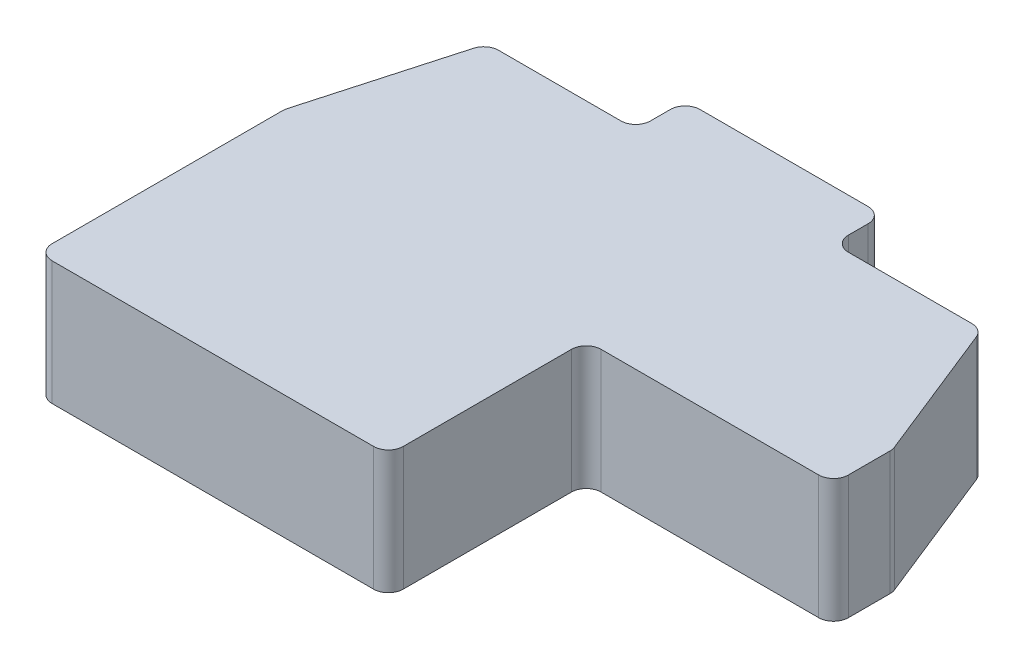
ISO-10303-21;
HEADER;
FILE_DESCRIPTION(('STEP AP214'),'2;1');
FILE_NAME('part.step','',(''),(''),'','','');
FILE_SCHEMA(('AUTOMOTIVE_DESIGN { 1 0 10303 214 1 1 1 1 }'));
ENDSEC;
DATA;
#1=APPLICATION_CONTEXT('core data for automotive mechanical design processes');
#2=APPLICATION_PROTOCOL_DEFINITION('international standard','automotive_design',2000,#1);
#3=PRODUCT_CONTEXT('',#1,'mechanical');
#4=PRODUCT('Part','Part','',(#3));
#5=PRODUCT_RELATED_PRODUCT_CATEGORY('part','',(#4));
#6=PRODUCT_DEFINITION_FORMATION('','',#4);
#7=PRODUCT_DEFINITION_CONTEXT('part definition',#1,'design');
#8=PRODUCT_DEFINITION('design','',#6,#7);
#9=PRODUCT_DEFINITION_SHAPE('','',#8);
#10=(LENGTH_UNIT() NAMED_UNIT(*) SI_UNIT(.MILLI.,.METRE.));
#11=(NAMED_UNIT(*) PLANE_ANGLE_UNIT() SI_UNIT($,.RADIAN.));
#12=(NAMED_UNIT(*) SI_UNIT($,.STERADIAN.) SOLID_ANGLE_UNIT());
#13=UNCERTAINTY_MEASURE_WITH_UNIT(LENGTH_MEASURE(1.E-05),#10,'distance_accuracy_value','');
#14=(GEOMETRIC_REPRESENTATION_CONTEXT(3) GLOBAL_UNCERTAINTY_ASSIGNED_CONTEXT((#13)) GLOBAL_UNIT_ASSIGNED_CONTEXT((#10,
#11,#12)) REPRESENTATION_CONTEXT('',''));
#15=CARTESIAN_POINT('',(0.,0.,0.));
#16=DIRECTION('',(0.,0.,1.));
#17=DIRECTION('',(1.,0.,0.));
#18=AXIS2_PLACEMENT_3D('',#15,#16,#17);
#19=CARTESIAN_POINT('',(5.00000000000001,25.,-49.));
#20=DIRECTION('',(0.,-1.,0.));
#21=DIRECTION('',(0.,0.,-1.));
#22=AXIS2_PLACEMENT_3D('',#19,#20,#21);
#23=CYLINDRICAL_SURFACE('',#22,3.);
#24=CARTESIAN_POINT('',(5.00000000000001,0.,-49.));
#25=DIRECTION('',(0.,1.,0.));
#26=DIRECTION('',(0.,0.,1.));
#27=AXIS2_PLACEMENT_3D('',#24,#25,#26);
#28=CIRCLE('',#27,3.);
#29=CARTESIAN_POINT('',(8.00000000000001,0.,-49.));
#30=VERTEX_POINT('',#29);
#31=CARTESIAN_POINT('',(4.99999999999999,0.,-52.));
#32=VERTEX_POINT('',#31);
#33=EDGE_CURVE('E233',#30,#32,#28,.T.);
#34=ORIENTED_EDGE('',*,*,#33,.T.);
#35=DIRECTION('',(0.,-1.,0.));
#36=VECTOR('',#35,1.);
#37=CARTESIAN_POINT('',(4.99999999999999,25.,-52.));
#38=LINE('',#37,#36);
#39=CARTESIAN_POINT('',(4.99999999999999,25.,-52.));
#40=VERTEX_POINT('',#39);
#41=EDGE_CURVE('E11',#40,#32,#38,.T.);
#42=ORIENTED_EDGE('',*,*,#41,.F.);
#43=CARTESIAN_POINT('',(5.00000000000001,25.,-49.));
#44=DIRECTION('',(0.,1.,0.));
#45=DIRECTION('',(0.,0.,1.));
#46=AXIS2_PLACEMENT_3D('',#43,#44,#45);
#47=CIRCLE('',#46,3.);
#48=CARTESIAN_POINT('',(8.00000000000001,25.,-49.));
#49=VERTEX_POINT('',#48);
#50=EDGE_CURVE('E279',#49,#40,#47,.T.);
#51=ORIENTED_EDGE('',*,*,#50,.F.);
#52=DIRECTION('',(0.,-1.,0.));
#53=VECTOR('',#52,1.);
#54=CARTESIAN_POINT('',(8.00000000000001,25.,-49.));
#55=LINE('',#54,#53);
#56=EDGE_CURVE('E229',#49,#30,#55,.T.);
#57=ORIENTED_EDGE('',*,*,#56,.T.);
#58=EDGE_LOOP('',(#34,#42,#51,#57));
#59=FACE_BOUND('',#58,.T.);
#60=ADVANCED_FACE('F41',(#59),#23,.T.);
#61=CARTESIAN_POINT('',(4.99999999999999,25.,-52.));
#62=DIRECTION('',(0.,0.,1.));
#63=DIRECTION('',(1.,0.,0.));
#64=AXIS2_PLACEMENT_3D('',#61,#62,#63);
#65=PLANE('',#64);
#66=DIRECTION('',(-1.,0.,0.));
#67=VECTOR('',#66,1.);
#68=CARTESIAN_POINT('',(4.99999999999999,0.,-52.));
#69=LINE('',#68,#67);
#70=CARTESIAN_POINT('',(-29.,0.,-52.));
#71=VERTEX_POINT('',#70);
#72=EDGE_CURVE('E236',#32,#71,#69,.T.);
#73=ORIENTED_EDGE('',*,*,#72,.T.);
#74=DIRECTION('',(0.,-1.,0.));
#75=VECTOR('',#74,1.);
#76=CARTESIAN_POINT('',(-29.,25.,-52.));
#77=LINE('',#76,#75);
#78=CARTESIAN_POINT('',(-29.,25.,-52.));
#79=VERTEX_POINT('',#78);
#80=EDGE_CURVE('E49',#79,#71,#77,.T.);
#81=ORIENTED_EDGE('',*,*,#80,.F.);
#82=DIRECTION('',(-1.,0.,0.));
#83=VECTOR('',#82,1.);
#84=CARTESIAN_POINT('',(4.99999999999999,25.,-52.));
#85=LINE('',#84,#83);
#86=EDGE_CURVE('E148',#40,#79,#85,.T.);
#87=ORIENTED_EDGE('',*,*,#86,.F.);
#88=ORIENTED_EDGE('',*,*,#41,.T.);
#89=EDGE_LOOP('',(#73,#81,#87,#88));
#90=FACE_BOUND('',#89,.T.);
#91=ADVANCED_FACE('F417',(#90),#65,.F.);
#92=CARTESIAN_POINT('',(-29.,25.,-49.));
#93=DIRECTION('',(0.,-1.,0.));
#94=DIRECTION('',(0.,0.,-1.));
#95=AXIS2_PLACEMENT_3D('',#92,#93,#94);
#96=CYLINDRICAL_SURFACE('',#95,3.);
#97=CARTESIAN_POINT('',(-29.,0.,-49.));
#98=DIRECTION('',(0.,1.,0.));
#99=DIRECTION('',(0.,0.,1.));
#100=AXIS2_PLACEMENT_3D('',#97,#98,#99);
#101=CIRCLE('',#100,3.);
#102=CARTESIAN_POINT('',(-32.,0.,-49.));
#103=VERTEX_POINT('',#102);
#104=EDGE_CURVE('E238',#71,#103,#101,.T.);
#105=ORIENTED_EDGE('',*,*,#104,.T.);
#106=DIRECTION('',(0.,-1.,0.));
#107=VECTOR('',#106,1.);
#108=CARTESIAN_POINT('',(-32.,25.,-49.));
#109=LINE('',#108,#107);
#110=CARTESIAN_POINT('',(-32.,25.,-49.));
#111=VERTEX_POINT('',#110);
#112=EDGE_CURVE('E334',#111,#103,#109,.T.);
#113=ORIENTED_EDGE('',*,*,#112,.F.);
#114=CARTESIAN_POINT('',(-29.,25.,-49.));
#115=DIRECTION('',(0.,1.,0.));
#116=DIRECTION('',(0.,0.,1.));
#117=AXIS2_PLACEMENT_3D('',#114,#115,#116);
#118=CIRCLE('',#117,3.);
#119=EDGE_CURVE('E342',#79,#111,#118,.T.);
#120=ORIENTED_EDGE('',*,*,#119,.F.);
#121=ORIENTED_EDGE('',*,*,#80,.T.);
#122=EDGE_LOOP('',(#105,#113,#120,#121));
#123=FACE_BOUND('',#122,.T.);
#124=ADVANCED_FACE('F340',(#123),#96,.T.);
#125=CARTESIAN_POINT('',(-32.,25.,-49.));
#126=DIRECTION('',(1.,0.,0.));
#127=DIRECTION('',(0.,0.,-1.));
#128=AXIS2_PLACEMENT_3D('',#125,#126,#127);
#129=PLANE('',#128);
#130=DIRECTION('',(0.,0.,1.));
#131=VECTOR('',#130,1.);
#132=CARTESIAN_POINT('',(-32.,0.,-49.));
#133=LINE('',#132,#131);
#134=CARTESIAN_POINT('',(-32.,0.,-45.));
#135=VERTEX_POINT('',#134);
#136=EDGE_CURVE('E240',#103,#135,#133,.T.);
#137=ORIENTED_EDGE('',*,*,#136,.T.);
#138=DIRECTION('',(0.,-1.,0.));
#139=VECTOR('',#138,1.);
#140=CARTESIAN_POINT('',(-32.,25.,-45.));
#141=LINE('',#140,#139);
#142=CARTESIAN_POINT('',(-32.,25.,-45.));
#143=VERTEX_POINT('',#142);
#144=EDGE_CURVE('E331',#143,#135,#141,.T.);
#145=ORIENTED_EDGE('',*,*,#144,.F.);
#146=DIRECTION('',(0.,0.,1.));
#147=VECTOR('',#146,1.);
#148=CARTESIAN_POINT('',(-32.,25.,-49.));
#149=LINE('',#148,#147);
#150=EDGE_CURVE('E360',#111,#143,#149,.T.);
#151=ORIENTED_EDGE('',*,*,#150,.F.);
#152=ORIENTED_EDGE('',*,*,#112,.T.);
#153=EDGE_LOOP('',(#137,#145,#151,#152));
#154=FACE_BOUND('',#153,.T.);
#155=ADVANCED_FACE('F351',(#154),#129,.F.);
#156=CARTESIAN_POINT('',(-35.,25.,-45.));
#157=DIRECTION('',(0.,-1.,0.));
#158=DIRECTION('',(0.,0.,-1.));
#159=AXIS2_PLACEMENT_3D('',#156,#157,#158);
#160=CYLINDRICAL_SURFACE('',#159,3.);
#161=CARTESIAN_POINT('',(-35.,0.,-45.));
#162=DIRECTION('',(0.,-1.,0.));
#163=DIRECTION('',(0.,0.,-1.));
#164=AXIS2_PLACEMENT_3D('',#161,#162,#163);
#165=CIRCLE('',#164,3.);
#166=CARTESIAN_POINT('',(-35.,0.,-42.));
#167=VERTEX_POINT('',#166);
#168=EDGE_CURVE('E242',#135,#167,#165,.T.);
#169=ORIENTED_EDGE('',*,*,#168,.T.);
#170=DIRECTION('',(0.,-1.,0.));
#171=VECTOR('',#170,1.);
#172=CARTESIAN_POINT('',(-35.,25.,-42.));
#173=LINE('',#172,#171);
#174=CARTESIAN_POINT('',(-35.,25.,-42.));
#175=VERTEX_POINT('',#174);
#176=EDGE_CURVE('E328',#175,#167,#173,.T.);
#177=ORIENTED_EDGE('',*,*,#176,.F.);
#178=CARTESIAN_POINT('',(-35.,25.,-45.));
#179=DIRECTION('',(0.,-1.,0.));
#180=DIRECTION('',(0.,0.,-1.));
#181=AXIS2_PLACEMENT_3D('',#178,#179,#180);
#182=CIRCLE('',#181,3.);
#183=EDGE_CURVE('E357',#143,#175,#182,.T.);
#184=ORIENTED_EDGE('',*,*,#183,.F.);
#185=ORIENTED_EDGE('',*,*,#144,.T.);
#186=EDGE_LOOP('',(#169,#177,#184,#185));
#187=FACE_BOUND('',#186,.T.);
#188=ADVANCED_FACE('F355',(#187),#160,.F.);
#189=CARTESIAN_POINT('',(-35.,25.,-42.));
#190=DIRECTION('',(0.,0.,1.));
#191=DIRECTION('',(1.,0.,0.));
#192=AXIS2_PLACEMENT_3D('',#189,#190,#191);
#193=PLANE('',#192);
#194=DIRECTION('',(-1.,0.,0.));
#195=VECTOR('',#194,1.);
#196=CARTESIAN_POINT('',(-35.,0.,-42.));
#197=LINE('',#196,#195);
#198=CARTESIAN_POINT('',(-59.7273555990135,0.,-42.));
#199=VERTEX_POINT('',#198);
#200=EDGE_CURVE('E244',#167,#199,#197,.T.);
#201=ORIENTED_EDGE('',*,*,#200,.T.);
#202=DIRECTION('',(0.,-1.,0.));
#203=VECTOR('',#202,1.);
#204=CARTESIAN_POINT('',(-59.7273555990135,25.,-42.));
#205=LINE('',#204,#203);
#206=CARTESIAN_POINT('',(-59.7273555990135,25.,-42.));
#207=VERTEX_POINT('',#206);
#208=EDGE_CURVE('E325',#207,#199,#205,.T.);
#209=ORIENTED_EDGE('',*,*,#208,.F.);
#210=DIRECTION('',(-1.,0.,0.));
#211=VECTOR('',#210,1.);
#212=CARTESIAN_POINT('',(-35.,25.,-42.));
#213=LINE('',#212,#211);
#214=EDGE_CURVE('E359',#175,#207,#213,.T.);
#215=ORIENTED_EDGE('',*,*,#214,.F.);
#216=ORIENTED_EDGE('',*,*,#176,.T.);
#217=EDGE_LOOP('',(#201,#209,#215,#216));
#218=FACE_BOUND('',#217,.T.);
#219=ADVANCED_FACE('F430',(#218),#193,.F.);
#220=CARTESIAN_POINT('',(-59.7273555990135,25.,-39.));
#221=DIRECTION('',(0.,-1.,0.));
#222=DIRECTION('',(0.,0.,-1.));
#223=AXIS2_PLACEMENT_3D('',#220,#221,#222);
#224=CYLINDRICAL_SURFACE('',#223,3.);
#225=CARTESIAN_POINT('',(-59.7273555990135,0.,-39.));
#226=DIRECTION('',(0.,1.,0.));
#227=DIRECTION('',(0.,0.,1.));
#228=AXIS2_PLACEMENT_3D('',#225,#226,#227);
#229=CIRCLE('',#228,3.);
#230=CARTESIAN_POINT('',(-62.6153084194752,0.,-39.8122367307548));
#231=VERTEX_POINT('',#230);
#232=EDGE_CURVE('E246',#199,#231,#229,.T.);
#233=ORIENTED_EDGE('',*,*,#232,.T.);
#234=DIRECTION('',(0.,-1.,0.));
#235=VECTOR('',#234,1.);
#236=CARTESIAN_POINT('',(-62.6153084194752,25.,-39.8122367307548));
#237=LINE('',#236,#235);
#238=CARTESIAN_POINT('',(-62.6153084194752,25.,-39.8122367307548));
#239=VERTEX_POINT('',#238);
#240=EDGE_CURVE('E322',#239,#231,#237,.T.);
#241=ORIENTED_EDGE('',*,*,#240,.F.);
#242=CARTESIAN_POINT('',(-59.7273555990135,25.,-39.));
#243=DIRECTION('',(0.,1.,0.));
#244=DIRECTION('',(0.,0.,1.));
#245=AXIS2_PLACEMENT_3D('',#242,#243,#244);
#246=CIRCLE('',#245,3.);
#247=EDGE_CURVE('E362',#207,#239,#246,.T.);
#248=ORIENTED_EDGE('',*,*,#247,.F.);
#249=ORIENTED_EDGE('',*,*,#208,.T.);
#250=EDGE_LOOP('',(#233,#241,#248,#249));
#251=FACE_BOUND('',#250,.T.);
#252=ADVANCED_FACE('F433',(#251),#224,.T.);
#253=CARTESIAN_POINT('',(-62.6153084194752,25.,-39.8122367307548));
#254=DIRECTION('',(0.962650940153899,0.,0.270745576918284));
#255=DIRECTION('',(0.270745576918284,0.,-0.962650940153899));
#256=AXIS2_PLACEMENT_3D('',#253,#254,#255);
#257=PLANE('',#256);
#258=DIRECTION('',(-0.270745576918284,0.,0.962650940153899));
#259=VECTOR('',#258,1.);
#260=CARTESIAN_POINT('',(-62.6153084194752,0.,-39.8122367307548));
#261=LINE('',#260,#259);
#262=CARTESIAN_POINT('',(-70.8879528204617,0.,-10.3983899716918));
#263=VERTEX_POINT('',#262);
#264=EDGE_CURVE('E248',#231,#263,#261,.T.);
#265=ORIENTED_EDGE('',*,*,#264,.T.);
#266=DIRECTION('',(0.,-1.,0.));
#267=VECTOR('',#266,1.);
#268=CARTESIAN_POINT('',(-70.8879528204617,25.,-10.3983899716918));
#269=LINE('',#268,#267);
#270=CARTESIAN_POINT('',(-70.8879528204617,25.,-10.3983899716918));
#271=VERTEX_POINT('',#270);
#272=EDGE_CURVE('E319',#271,#263,#269,.T.);
#273=ORIENTED_EDGE('',*,*,#272,.F.);
#274=DIRECTION('',(-0.270745576918284,0.,0.962650940153899));
#275=VECTOR('',#274,1.);
#276=CARTESIAN_POINT('',(-62.6153084194752,25.,-39.8122367307548));
#277=LINE('',#276,#275);
#278=EDGE_CURVE('E368',#239,#271,#277,.T.);
#279=ORIENTED_EDGE('',*,*,#278,.F.);
#280=ORIENTED_EDGE('',*,*,#240,.T.);
#281=EDGE_LOOP('',(#265,#273,#279,#280));
#282=FACE_BOUND('',#281,.T.);
#283=ADVANCED_FACE('F437',(#282),#257,.F.);
#284=CARTESIAN_POINT('',(-68.,25.,-9.58615324093689));
#285=DIRECTION('',(0.,-1.,0.));
#286=DIRECTION('',(0.,0.,-1.));
#287=AXIS2_PLACEMENT_3D('',#284,#285,#286);
#288=CYLINDRICAL_SURFACE('',#287,3.);
#289=CARTESIAN_POINT('',(-68.,0.,-9.58615324093689));
#290=DIRECTION('',(0.,1.,0.));
#291=DIRECTION('',(0.,0.,-1.));
#292=AXIS2_PLACEMENT_3D('',#289,#290,#291);
#293=CIRCLE('',#292,3.);
#294=CARTESIAN_POINT('',(-71.,0.,-9.58615324093688));
#295=VERTEX_POINT('',#294);
#296=EDGE_CURVE('E250',#263,#295,#293,.T.);
#297=ORIENTED_EDGE('',*,*,#296,.T.);
#298=DIRECTION('',(0.,-1.,0.));
#299=VECTOR('',#298,1.);
#300=CARTESIAN_POINT('',(-71.,25.,-9.58615324093688));
#301=LINE('',#300,#299);
#302=CARTESIAN_POINT('',(-71.,25.,-9.58615324093688));
#303=VERTEX_POINT('',#302);
#304=EDGE_CURVE('E316',#303,#295,#301,.T.);
#305=ORIENTED_EDGE('',*,*,#304,.F.);
#306=CARTESIAN_POINT('',(-68.,25.,-9.58615324093689));
#307=DIRECTION('',(0.,1.,0.));
#308=DIRECTION('',(0.,0.,-1.));
#309=AXIS2_PLACEMENT_3D('',#306,#307,#308);
#310=CIRCLE('',#309,3.);
#311=EDGE_CURVE('E370',#271,#303,#310,.T.);
#312=ORIENTED_EDGE('',*,*,#311,.F.);
#313=ORIENTED_EDGE('',*,*,#272,.T.);
#314=EDGE_LOOP('',(#297,#305,#312,#313));
#315=FACE_BOUND('',#314,.T.);
#316=ADVANCED_FACE('F441',(#315),#288,.T.);
#317=CARTESIAN_POINT('',(-71.,25.,37.));
#318=DIRECTION('',(1.,0.,0.));
#319=DIRECTION('',(0.,0.,-1.));
#320=AXIS2_PLACEMENT_3D('',#317,#318,#319);
#321=PLANE('',#320);
#322=DIRECTION('',(0.,0.,1.));
#323=VECTOR('',#322,1.);
#324=CARTESIAN_POINT('',(-71.,0.,37.));
#325=LINE('',#324,#323);
#326=CARTESIAN_POINT('',(-71.,0.,37.));
#327=VERTEX_POINT('',#326);
#328=EDGE_CURVE('E252',#295,#327,#325,.T.);
#329=ORIENTED_EDGE('',*,*,#328,.T.);
#330=DIRECTION('',(0.,-1.,0.));
#331=VECTOR('',#330,1.);
#332=CARTESIAN_POINT('',(-71.,25.,37.));
#333=LINE('',#332,#331);
#334=CARTESIAN_POINT('',(-71.,25.,37.));
#335=VERTEX_POINT('',#334);
#336=EDGE_CURVE('E313',#335,#327,#333,.T.);
#337=ORIENTED_EDGE('',*,*,#336,.F.);
#338=DIRECTION('',(0.,0.,1.));
#339=VECTOR('',#338,1.);
#340=CARTESIAN_POINT('',(-71.,25.,37.));
#341=LINE('',#340,#339);
#342=EDGE_CURVE('E372',#303,#335,#341,.T.);
#343=ORIENTED_EDGE('',*,*,#342,.F.);
#344=ORIENTED_EDGE('',*,*,#304,.T.);
#345=EDGE_LOOP('',(#329,#337,#343,#344));
#346=FACE_BOUND('',#345,.T.);
#347=ADVANCED_FACE('F445',(#346),#321,.F.);
#348=CARTESIAN_POINT('',(-68.,25.,37.));
#349=DIRECTION('',(0.,-1.,0.));
#350=DIRECTION('',(0.,0.,-1.));
#351=AXIS2_PLACEMENT_3D('',#348,#349,#350);
#352=CYLINDRICAL_SURFACE('',#351,3.);
#353=CARTESIAN_POINT('',(-68.,0.,37.));
#354=DIRECTION('',(0.,1.,0.));
#355=DIRECTION('',(0.,0.,-1.));
#356=AXIS2_PLACEMENT_3D('',#353,#354,#355);
#357=CIRCLE('',#356,3.);
#358=CARTESIAN_POINT('',(-68.,0.,40.));
#359=VERTEX_POINT('',#358);
#360=EDGE_CURVE('E254',#327,#359,#357,.T.);
#361=ORIENTED_EDGE('',*,*,#360,.T.);
#362=DIRECTION('',(0.,-1.,0.));
#363=VECTOR('',#362,1.);
#364=CARTESIAN_POINT('',(-68.,25.,40.));
#365=LINE('',#364,#363);
#366=CARTESIAN_POINT('',(-68.,25.,40.));
#367=VERTEX_POINT('',#366);
#368=EDGE_CURVE('E310',#367,#359,#365,.T.);
#369=ORIENTED_EDGE('',*,*,#368,.F.);
#370=CARTESIAN_POINT('',(-68.,25.,37.));
#371=DIRECTION('',(0.,1.,0.));
#372=DIRECTION('',(0.,0.,-1.));
#373=AXIS2_PLACEMENT_3D('',#370,#371,#372);
#374=CIRCLE('',#373,3.);
#375=EDGE_CURVE('E374',#335,#367,#374,.T.);
#376=ORIENTED_EDGE('',*,*,#375,.F.);
#377=ORIENTED_EDGE('',*,*,#336,.T.);
#378=EDGE_LOOP('',(#361,#369,#376,#377));
#379=FACE_BOUND('',#378,.T.);
#380=ADVANCED_FACE('F449',(#379),#352,.T.);
#381=CARTESIAN_POINT('',(-3.00000000000002,25.,40.));
#382=DIRECTION('',(0.,0.,-1.));
#383=DIRECTION('',(-1.,0.,0.));
#384=AXIS2_PLACEMENT_3D('',#381,#382,#383);
#385=PLANE('',#384);
#386=DIRECTION('',(1.,0.,0.));
#387=VECTOR('',#386,1.);
#388=CARTESIAN_POINT('',(-3.00000000000002,0.,40.));
#389=LINE('',#388,#387);
#390=CARTESIAN_POINT('',(-3.00000000000002,0.,40.));
#391=VERTEX_POINT('',#390);
#392=EDGE_CURVE('E256',#359,#391,#389,.T.);
#393=ORIENTED_EDGE('',*,*,#392,.T.);
#394=DIRECTION('',(0.,-1.,0.));
#395=VECTOR('',#394,1.);
#396=CARTESIAN_POINT('',(-3.00000000000002,25.,40.));
#397=LINE('',#396,#395);
#398=CARTESIAN_POINT('',(-3.00000000000002,25.,40.));
#399=VERTEX_POINT('',#398);
#400=EDGE_CURVE('E307',#399,#391,#397,.T.);
#401=ORIENTED_EDGE('',*,*,#400,.F.);
#402=DIRECTION('',(1.,0.,0.));
#403=VECTOR('',#402,1.);
#404=CARTESIAN_POINT('',(-3.00000000000002,25.,40.));
#405=LINE('',#404,#403);
#406=EDGE_CURVE('E376',#367,#399,#405,.T.);
#407=ORIENTED_EDGE('',*,*,#406,.F.);
#408=ORIENTED_EDGE('',*,*,#368,.T.);
#409=EDGE_LOOP('',(#393,#401,#407,#408));
#410=FACE_BOUND('',#409,.T.);
#411=ADVANCED_FACE('F453',(#410),#385,.F.);
#412=CARTESIAN_POINT('',(-3.,25.,37.));
#413=DIRECTION('',(0.,-1.,0.));
#414=DIRECTION('',(0.,0.,-1.));
#415=AXIS2_PLACEMENT_3D('',#412,#413,#414);
#416=CYLINDRICAL_SURFACE('',#415,3.);
#417=CARTESIAN_POINT('',(-3.,0.,37.));
#418=DIRECTION('',(0.,1.,0.));
#419=DIRECTION('',(0.,0.,-1.));
#420=AXIS2_PLACEMENT_3D('',#417,#418,#419);
#421=CIRCLE('',#420,3.);
#422=CARTESIAN_POINT('',(0.,0.,37.));
#423=VERTEX_POINT('',#422);
#424=EDGE_CURVE('E258',#391,#423,#421,.T.);
#425=ORIENTED_EDGE('',*,*,#424,.T.);
#426=DIRECTION('',(0.,-1.,0.));
#427=VECTOR('',#426,1.);
#428=CARTESIAN_POINT('',(0.,25.,37.));
#429=LINE('',#428,#427);
#430=CARTESIAN_POINT('',(0.,25.,37.));
#431=VERTEX_POINT('',#430);
#432=EDGE_CURVE('E304',#431,#423,#429,.T.);
#433=ORIENTED_EDGE('',*,*,#432,.F.);
#434=CARTESIAN_POINT('',(-3.,25.,37.));
#435=DIRECTION('',(0.,1.,0.));
#436=DIRECTION('',(0.,0.,-1.));
#437=AXIS2_PLACEMENT_3D('',#434,#435,#436);
#438=CIRCLE('',#437,3.);
#439=EDGE_CURVE('E378',#399,#431,#438,.T.);
#440=ORIENTED_EDGE('',*,*,#439,.F.);
#441=ORIENTED_EDGE('',*,*,#400,.T.);
#442=EDGE_LOOP('',(#425,#433,#440,#441));
#443=FACE_BOUND('',#442,.T.);
#444=ADVANCED_FACE('F457',(#443),#416,.T.);
#445=CARTESIAN_POINT('',(0.,25.,3.00000000000002));
#446=DIRECTION('',(-1.,0.,0.));
#447=DIRECTION('',(0.,0.,1.));
#448=AXIS2_PLACEMENT_3D('',#445,#446,#447);
#449=PLANE('',#448);
#450=DIRECTION('',(0.,0.,-1.));
#451=VECTOR('',#450,1.);
#452=CARTESIAN_POINT('',(0.,0.,3.00000000000002));
#453=LINE('',#452,#451);
#454=CARTESIAN_POINT('',(0.,0.,3.00000000000002));
#455=VERTEX_POINT('',#454);
#456=EDGE_CURVE('E260',#423,#455,#453,.T.);
#457=ORIENTED_EDGE('',*,*,#456,.T.);
#458=DIRECTION('',(0.,-1.,0.));
#459=VECTOR('',#458,1.);
#460=CARTESIAN_POINT('',(0.,25.,3.00000000000002));
#461=LINE('',#460,#459);
#462=CARTESIAN_POINT('',(0.,25.,3.00000000000002));
#463=VERTEX_POINT('',#462);
#464=EDGE_CURVE('E301',#463,#455,#461,.T.);
#465=ORIENTED_EDGE('',*,*,#464,.F.);
#466=DIRECTION('',(0.,0.,-1.));
#467=VECTOR('',#466,1.);
#468=CARTESIAN_POINT('',(0.,25.,3.00000000000002));
#469=LINE('',#468,#467);
#470=EDGE_CURVE('E380',#431,#463,#469,.T.);
#471=ORIENTED_EDGE('',*,*,#470,.F.);
#472=ORIENTED_EDGE('',*,*,#432,.T.);
#473=EDGE_LOOP('',(#457,#465,#471,#472));
#474=FACE_BOUND('',#473,.T.);
#475=ADVANCED_FACE('F461',(#474),#449,.F.);
#476=CARTESIAN_POINT('',(3.,25.,3.));
#477=DIRECTION('',(0.,-1.,0.));
#478=DIRECTION('',(0.,0.,-1.));
#479=AXIS2_PLACEMENT_3D('',#476,#477,#478);
#480=CYLINDRICAL_SURFACE('',#479,3.);
#481=CARTESIAN_POINT('',(3.,0.,3.));
#482=DIRECTION('',(0.,-1.,0.));
#483=DIRECTION('',(0.,0.,-1.));
#484=AXIS2_PLACEMENT_3D('',#481,#482,#483);
#485=CIRCLE('',#484,3.);
#486=CARTESIAN_POINT('',(3.00000000000002,0.,0.));
#487=VERTEX_POINT('',#486);
#488=EDGE_CURVE('E262',#455,#487,#485,.T.);
#489=ORIENTED_EDGE('',*,*,#488,.T.);
#490=DIRECTION('',(0.,-1.,0.));
#491=VECTOR('',#490,1.);
#492=CARTESIAN_POINT('',(3.00000000000002,25.,0.));
#493=LINE('',#492,#491);
#494=CARTESIAN_POINT('',(3.00000000000002,25.,0.));
#495=VERTEX_POINT('',#494);
#496=EDGE_CURVE('E298',#495,#487,#493,.T.);
#497=ORIENTED_EDGE('',*,*,#496,.F.);
#498=CARTESIAN_POINT('',(3.,25.,3.));
#499=DIRECTION('',(0.,-1.,0.));
#500=DIRECTION('',(0.,0.,-1.));
#501=AXIS2_PLACEMENT_3D('',#498,#499,#500);
#502=CIRCLE('',#501,3.);
#503=EDGE_CURVE('E382',#463,#495,#502,.T.);
#504=ORIENTED_EDGE('',*,*,#503,.F.);
#505=ORIENTED_EDGE('',*,*,#464,.T.);
#506=EDGE_LOOP('',(#489,#497,#504,#505));
#507=FACE_BOUND('',#506,.T.);
#508=ADVANCED_FACE('F465',(#507),#480,.F.);
#509=CARTESIAN_POINT('',(3.00000000000002,25.,0.));
#510=DIRECTION('',(0.,0.,-1.));
#511=DIRECTION('',(-1.,0.,0.));
#512=AXIS2_PLACEMENT_3D('',#509,#510,#511);
#513=PLANE('',#512);
#514=DIRECTION('',(1.,0.,0.));
#515=VECTOR('',#514,1.);
#516=CARTESIAN_POINT('',(3.00000000000002,0.,0.));
#517=LINE('',#516,#515);
#518=CARTESIAN_POINT('',(47.,0.,0.));
#519=VERTEX_POINT('',#518);
#520=EDGE_CURVE('E264',#487,#519,#517,.T.);
#521=ORIENTED_EDGE('',*,*,#520,.T.);
#522=DIRECTION('',(0.,-1.,0.));
#523=VECTOR('',#522,1.);
#524=CARTESIAN_POINT('',(47.,25.,0.));
#525=LINE('',#524,#523);
#526=CARTESIAN_POINT('',(47.,25.,0.));
#527=VERTEX_POINT('',#526);
#528=EDGE_CURVE('E295',#527,#519,#525,.T.);
#529=ORIENTED_EDGE('',*,*,#528,.F.);
#530=DIRECTION('',(1.,0.,0.));
#531=VECTOR('',#530,1.);
#532=CARTESIAN_POINT('',(3.00000000000002,25.,0.));
#533=LINE('',#532,#531);
#534=EDGE_CURVE('E384',#495,#527,#533,.T.);
#535=ORIENTED_EDGE('',*,*,#534,.F.);
#536=ORIENTED_EDGE('',*,*,#496,.T.);
#537=EDGE_LOOP('',(#521,#529,#535,#536));
#538=FACE_BOUND('',#537,.T.);
#539=ADVANCED_FACE('F469',(#538),#513,.F.);
#540=CARTESIAN_POINT('',(47.,25.,-3.));
#541=DIRECTION('',(0.,-1.,0.));
#542=DIRECTION('',(0.,0.,-1.));
#543=AXIS2_PLACEMENT_3D('',#540,#541,#542);
#544=CYLINDRICAL_SURFACE('',#543,3.);
#545=CARTESIAN_POINT('',(47.,0.,-3.));
#546=DIRECTION('',(0.,1.,0.));
#547=DIRECTION('',(0.,0.,1.));
#548=AXIS2_PLACEMENT_3D('',#545,#546,#547);
#549=CIRCLE('',#548,3.);
#550=CARTESIAN_POINT('',(50.,0.,-3.00000000000002));
#551=VERTEX_POINT('',#550);
#552=EDGE_CURVE('E266',#519,#551,#549,.T.);
#553=ORIENTED_EDGE('',*,*,#552,.T.);
#554=DIRECTION('',(0.,-1.,0.));
#555=VECTOR('',#554,1.);
#556=CARTESIAN_POINT('',(50.,25.,-3.00000000000002));
#557=LINE('',#556,#555);
#558=CARTESIAN_POINT('',(50.,25.,-3.00000000000002));
#559=VERTEX_POINT('',#558);
#560=EDGE_CURVE('E292',#559,#551,#557,.T.);
#561=ORIENTED_EDGE('',*,*,#560,.F.);
#562=CARTESIAN_POINT('',(47.,25.,-3.));
#563=DIRECTION('',(0.,1.,0.));
#564=DIRECTION('',(0.,0.,1.));
#565=AXIS2_PLACEMENT_3D('',#562,#563,#564);
#566=CIRCLE('',#565,3.);
#567=EDGE_CURVE('E386',#527,#559,#566,.T.);
#568=ORIENTED_EDGE('',*,*,#567,.F.);
#569=ORIENTED_EDGE('',*,*,#528,.T.);
#570=EDGE_LOOP('',(#553,#561,#568,#569));
#571=FACE_BOUND('',#570,.T.);
#572=ADVANCED_FACE('F473',(#571),#544,.T.);
#573=CARTESIAN_POINT('',(50.,25.,-3.00000000000002));
#574=DIRECTION('',(-1.,0.,0.));
#575=DIRECTION('',(0.,0.,1.));
#576=AXIS2_PLACEMENT_3D('',#573,#574,#575);
#577=PLANE('',#576);
#578=DIRECTION('',(0.,0.,-1.));
#579=VECTOR('',#578,1.);
#580=CARTESIAN_POINT('',(50.,0.,-3.00000000000002));
#581=LINE('',#580,#579);
#582=CARTESIAN_POINT('',(50.,0.,-11.4222527892982));
#583=VERTEX_POINT('',#582);
#584=EDGE_CURVE('E268',#551,#583,#581,.T.);
#585=ORIENTED_EDGE('',*,*,#584,.T.);
#586=DIRECTION('',(0.,-1.,0.));
#587=VECTOR('',#586,1.);
#588=CARTESIAN_POINT('',(50.,25.,-11.4222527892982));
#589=LINE('',#588,#587);
#590=CARTESIAN_POINT('',(50.,25.,-11.4222527892982));
#591=VERTEX_POINT('',#590);
#592=EDGE_CURVE('E289',#591,#583,#589,.T.);
#593=ORIENTED_EDGE('',*,*,#592,.F.);
#594=DIRECTION('',(0.,0.,-1.));
#595=VECTOR('',#594,1.);
#596=CARTESIAN_POINT('',(50.,25.,-3.00000000000002));
#597=LINE('',#596,#595);
#598=EDGE_CURVE('E388',#559,#591,#597,.T.);
#599=ORIENTED_EDGE('',*,*,#598,.F.);
#600=ORIENTED_EDGE('',*,*,#560,.T.);
#601=EDGE_LOOP('',(#585,#593,#599,#600));
#602=FACE_BOUND('',#601,.T.);
#603=ADVANCED_FACE('F477',(#602),#577,.F.);
#604=CARTESIAN_POINT('',(47.,25.,-11.4222527892982));
#605=DIRECTION('',(0.,-1.,0.));
#606=DIRECTION('',(0.,0.,-1.));
#607=AXIS2_PLACEMENT_3D('',#604,#605,#606);
#608=CYLINDRICAL_SURFACE('',#607,3.);
#609=CARTESIAN_POINT('',(47.,0.,-11.4222527892982));
#610=DIRECTION('',(0.,1.,0.));
#611=DIRECTION('',(0.,0.,1.));
#612=AXIS2_PLACEMENT_3D('',#609,#610,#611);
#613=CIRCLE('',#612,3.);
#614=CARTESIAN_POINT('',(49.7854300726558,0.,-12.5364248183606));
#615=VERTEX_POINT('',#614);
#616=EDGE_CURVE('E270',#583,#615,#613,.T.);
#617=ORIENTED_EDGE('',*,*,#616,.T.);
#618=DIRECTION('',(0.,-1.,0.));
#619=VECTOR('',#618,1.);
#620=CARTESIAN_POINT('',(49.7854300726558,25.,-12.5364248183606));
#621=LINE('',#620,#619);
#622=CARTESIAN_POINT('',(49.7854300726558,25.,-12.5364248183606));
#623=VERTEX_POINT('',#622);
#624=EDGE_CURVE('E286',#623,#615,#621,.T.);
#625=ORIENTED_EDGE('',*,*,#624,.F.);
#626=CARTESIAN_POINT('',(47.,25.,-11.4222527892982));
#627=DIRECTION('',(0.,1.,0.));
#628=DIRECTION('',(0.,0.,1.));
#629=AXIS2_PLACEMENT_3D('',#626,#627,#628);
#630=CIRCLE('',#629,3.);
#631=EDGE_CURVE('E390',#591,#623,#630,.T.);
#632=ORIENTED_EDGE('',*,*,#631,.F.);
#633=ORIENTED_EDGE('',*,*,#592,.T.);
#634=EDGE_LOOP('',(#617,#625,#632,#633));
#635=FACE_BOUND('',#634,.T.);
#636=ADVANCED_FACE('F481',(#635),#608,.T.);
#637=CARTESIAN_POINT('',(38.7543311883751,25.,-40.1141720290623));
#638=DIRECTION('',(-0.928476690885259,0.,0.371390676354104));
#639=DIRECTION('',(0.371390676354104,0.,0.928476690885259));
#640=AXIS2_PLACEMENT_3D('',#637,#638,#639);
#641=PLANE('',#640);
#642=DIRECTION('',(-0.371390676354104,0.,-0.928476690885259));
#643=VECTOR('',#642,1.);
#644=CARTESIAN_POINT('',(38.7543311883751,0.,-40.1141720290623));
#645=LINE('',#644,#643);
#646=CARTESIAN_POINT('',(38.7543311883751,0.,-40.1141720290623));
#647=VERTEX_POINT('',#646);
#648=EDGE_CURVE('E272',#615,#647,#645,.T.);
#649=ORIENTED_EDGE('',*,*,#648,.T.);
#650=DIRECTION('',(0.,-1.,0.));
#651=VECTOR('',#650,1.);
#652=CARTESIAN_POINT('',(38.7543311883751,25.,-40.1141720290623));
#653=LINE('',#652,#651);
#654=CARTESIAN_POINT('',(38.7543311883751,25.,-40.1141720290623));
#655=VERTEX_POINT('',#654);
#656=EDGE_CURVE('E283',#655,#647,#653,.T.);
#657=ORIENTED_EDGE('',*,*,#656,.F.);
#658=DIRECTION('',(-0.371390676354104,0.,-0.928476690885259));
#659=VECTOR('',#658,1.);
#660=CARTESIAN_POINT('',(38.7543311883751,25.,-40.1141720290623));
#661=LINE('',#660,#659);
#662=EDGE_CURVE('E392',#623,#655,#661,.T.);
#663=ORIENTED_EDGE('',*,*,#662,.F.);
#664=ORIENTED_EDGE('',*,*,#624,.T.);
#665=EDGE_LOOP('',(#649,#657,#663,#664));
#666=FACE_BOUND('',#665,.T.);
#667=ADVANCED_FACE('F398',(#666),#641,.F.);
#668=CARTESIAN_POINT('',(35.9689011157193,25.,-39.));
#669=DIRECTION('',(0.,-1.,0.));
#670=DIRECTION('',(0.,0.,-1.));
#671=AXIS2_PLACEMENT_3D('',#668,#669,#670);
#672=CYLINDRICAL_SURFACE('',#671,3.);
#673=CARTESIAN_POINT('',(35.9689011157193,0.,-39.));
#674=DIRECTION('',(0.,1.,0.));
#675=DIRECTION('',(0.,0.,1.));
#676=AXIS2_PLACEMENT_3D('',#673,#674,#675);
#677=CIRCLE('',#676,3.);
#678=CARTESIAN_POINT('',(35.9689011157193,0.,-42.));
#679=VERTEX_POINT('',#678);
#680=EDGE_CURVE('E274',#647,#679,#677,.T.);
#681=ORIENTED_EDGE('',*,*,#680,.T.);
#682=DIRECTION('',(0.,-1.,0.));
#683=VECTOR('',#682,1.);
#684=CARTESIAN_POINT('',(35.9689011157193,25.,-42.));
#685=LINE('',#684,#683);
#686=CARTESIAN_POINT('',(35.9689011157193,25.,-42.));
#687=VERTEX_POINT('',#686);
#688=EDGE_CURVE('E224',#687,#679,#685,.T.);
#689=ORIENTED_EDGE('',*,*,#688,.F.);
#690=CARTESIAN_POINT('',(35.9689011157193,25.,-39.));
#691=DIRECTION('',(0.,1.,0.));
#692=DIRECTION('',(0.,0.,1.));
#693=AXIS2_PLACEMENT_3D('',#690,#691,#692);
#694=CIRCLE('',#693,3.);
#695=EDGE_CURVE('E215',#655,#687,#694,.T.);
#696=ORIENTED_EDGE('',*,*,#695,.F.);
#697=ORIENTED_EDGE('',*,*,#656,.T.);
#698=EDGE_LOOP('',(#681,#689,#696,#697));
#699=FACE_BOUND('',#698,.T.);
#700=ADVANCED_FACE('F402',(#699),#672,.T.);
#701=CARTESIAN_POINT('',(35.9689011157193,25.,-42.));
#702=DIRECTION('',(0.,0.,1.));
#703=DIRECTION('',(1.,0.,0.));
#704=AXIS2_PLACEMENT_3D('',#701,#702,#703);
#705=PLANE('',#704);
#706=DIRECTION('',(-1.,0.,0.));
#707=VECTOR('',#706,1.);
#708=CARTESIAN_POINT('',(35.9689011157193,0.,-42.));
#709=LINE('',#708,#707);
#710=CARTESIAN_POINT('',(11.,0.,-42.));
#711=VERTEX_POINT('',#710);
#712=EDGE_CURVE('E223',#679,#711,#709,.T.);
#713=ORIENTED_EDGE('',*,*,#712,.T.);
#714=DIRECTION('',(0.,-1.,0.));
#715=VECTOR('',#714,1.);
#716=CARTESIAN_POINT('',(11.,25.,-42.));
#717=LINE('',#716,#715);
#718=CARTESIAN_POINT('',(11.,25.,-42.));
#719=VERTEX_POINT('',#718);
#720=EDGE_CURVE('E220',#719,#711,#717,.T.);
#721=ORIENTED_EDGE('',*,*,#720,.F.);
#722=DIRECTION('',(-1.,0.,0.));
#723=VECTOR('',#722,1.);
#724=CARTESIAN_POINT('',(35.9689011157193,25.,-42.));
#725=LINE('',#724,#723);
#726=EDGE_CURVE('E209',#687,#719,#725,.T.);
#727=ORIENTED_EDGE('',*,*,#726,.F.);
#728=ORIENTED_EDGE('',*,*,#688,.T.);
#729=EDGE_LOOP('',(#713,#721,#727,#728));
#730=FACE_BOUND('',#729,.T.);
#731=ADVANCED_FACE('F221',(#730),#705,.F.);
#732=CARTESIAN_POINT('',(11.,25.,-45.));
#733=DIRECTION('',(0.,-1.,0.));
#734=DIRECTION('',(0.,0.,-1.));
#735=AXIS2_PLACEMENT_3D('',#732,#733,#734);
#736=CYLINDRICAL_SURFACE('',#735,3.);
#737=CARTESIAN_POINT('',(11.,0.,-45.));
#738=DIRECTION('',(0.,-1.,0.));
#739=DIRECTION('',(0.,0.,-1.));
#740=AXIS2_PLACEMENT_3D('',#737,#738,#739);
#741=CIRCLE('',#740,3.);
#742=CARTESIAN_POINT('',(8.00000000000001,0.,-45.));
#743=VERTEX_POINT('',#742);
#744=EDGE_CURVE('E134',#711,#743,#741,.T.);
#745=ORIENTED_EDGE('',*,*,#744,.T.);
#746=DIRECTION('',(0.,-1.,0.));
#747=VECTOR('',#746,1.);
#748=CARTESIAN_POINT('',(8.00000000000001,25.,-45.));
#749=LINE('',#748,#747);
#750=CARTESIAN_POINT('',(8.00000000000001,25.,-45.));
#751=VERTEX_POINT('',#750);
#752=EDGE_CURVE('E225',#751,#743,#749,.T.);
#753=ORIENTED_EDGE('',*,*,#752,.F.);
#754=CARTESIAN_POINT('',(11.,25.,-45.));
#755=DIRECTION('',(0.,-1.,0.));
#756=DIRECTION('',(0.,0.,-1.));
#757=AXIS2_PLACEMENT_3D('',#754,#755,#756);
#758=CIRCLE('',#757,3.);
#759=EDGE_CURVE('E213',#719,#751,#758,.T.);
#760=ORIENTED_EDGE('',*,*,#759,.F.);
#761=ORIENTED_EDGE('',*,*,#720,.T.);
#762=EDGE_LOOP('',(#745,#753,#760,#761));
#763=FACE_BOUND('',#762,.T.);
#764=ADVANCED_FACE('F227',(#763),#736,.F.);
#765=CARTESIAN_POINT('',(8.00000000000001,25.,-45.));
#766=DIRECTION('',(-1.,0.,0.));
#767=DIRECTION('',(0.,0.,1.));
#768=AXIS2_PLACEMENT_3D('',#765,#766,#767);
#769=PLANE('',#768);
#770=DIRECTION('',(0.,0.,-1.));
#771=VECTOR('',#770,1.);
#772=CARTESIAN_POINT('',(8.00000000000001,0.,-45.));
#773=LINE('',#772,#771);
#774=EDGE_CURVE('E140',#743,#30,#773,.T.);
#775=ORIENTED_EDGE('',*,*,#774,.T.);
#776=ORIENTED_EDGE('',*,*,#56,.F.);
#777=DIRECTION('',(0.,0.,-1.));
#778=VECTOR('',#777,1.);
#779=CARTESIAN_POINT('',(8.00000000000001,25.,-45.));
#780=LINE('',#779,#778);
#781=EDGE_CURVE('E57',#751,#49,#780,.T.);
#782=ORIENTED_EDGE('',*,*,#781,.F.);
#783=ORIENTED_EDGE('',*,*,#752,.T.);
#784=EDGE_LOOP('',(#775,#776,#782,#783));
#785=FACE_BOUND('',#784,.T.);
#786=ADVANCED_FACE('F406',(#785),#769,.F.);
#787=CARTESIAN_POINT('',(5.00000000000001,25.,-49.));
#788=DIRECTION('',(0.,1.,0.));
#789=DIRECTION('',(0.,0.,1.));
#790=AXIS2_PLACEMENT_3D('',#787,#788,#789);
#791=PLANE('',#790);
#792=ORIENTED_EDGE('',*,*,#50,.T.);
#793=ORIENTED_EDGE('',*,*,#86,.T.);
#794=ORIENTED_EDGE('',*,*,#119,.T.);
#795=ORIENTED_EDGE('',*,*,#150,.T.);
#796=ORIENTED_EDGE('',*,*,#183,.T.);
#797=ORIENTED_EDGE('',*,*,#214,.T.);
#798=ORIENTED_EDGE('',*,*,#247,.T.);
#799=ORIENTED_EDGE('',*,*,#278,.T.);
#800=ORIENTED_EDGE('',*,*,#311,.T.);
#801=ORIENTED_EDGE('',*,*,#342,.T.);
#802=ORIENTED_EDGE('',*,*,#375,.T.);
#803=ORIENTED_EDGE('',*,*,#406,.T.);
#804=ORIENTED_EDGE('',*,*,#439,.T.);
#805=ORIENTED_EDGE('',*,*,#470,.T.);
#806=ORIENTED_EDGE('',*,*,#503,.T.);
#807=ORIENTED_EDGE('',*,*,#534,.T.);
#808=ORIENTED_EDGE('',*,*,#567,.T.);
#809=ORIENTED_EDGE('',*,*,#598,.T.);
#810=ORIENTED_EDGE('',*,*,#631,.T.);
#811=ORIENTED_EDGE('',*,*,#662,.T.);
#812=ORIENTED_EDGE('',*,*,#695,.T.);
#813=ORIENTED_EDGE('',*,*,#726,.T.);
#814=ORIENTED_EDGE('',*,*,#759,.T.);
#815=ORIENTED_EDGE('',*,*,#781,.T.);
#816=EDGE_LOOP('',(#792,#793,#794,#795,#796,#797,#798,#799,#800,#801,#802,#803,#804,#805,#806,
#807,#808,#809,#810,#811,#812,#813,#814,#815));
#817=FACE_BOUND('',#816,.T.);
#818=ADVANCED_FACE('F211',(#817),#791,.T.);
#819=CARTESIAN_POINT('',(5.00000000000001,0.,-49.));
#820=DIRECTION('',(0.,1.,0.));
#821=DIRECTION('',(0.,0.,1.));
#822=AXIS2_PLACEMENT_3D('',#819,#820,#821);
#823=PLANE('',#822);
#824=ORIENTED_EDGE('',*,*,#33,.F.);
#825=ORIENTED_EDGE('',*,*,#774,.F.);
#826=ORIENTED_EDGE('',*,*,#744,.F.);
#827=ORIENTED_EDGE('',*,*,#712,.F.);
#828=ORIENTED_EDGE('',*,*,#680,.F.);
#829=ORIENTED_EDGE('',*,*,#648,.F.);
#830=ORIENTED_EDGE('',*,*,#616,.F.);
#831=ORIENTED_EDGE('',*,*,#584,.F.);
#832=ORIENTED_EDGE('',*,*,#552,.F.);
#833=ORIENTED_EDGE('',*,*,#520,.F.);
#834=ORIENTED_EDGE('',*,*,#488,.F.);
#835=ORIENTED_EDGE('',*,*,#456,.F.);
#836=ORIENTED_EDGE('',*,*,#424,.F.);
#837=ORIENTED_EDGE('',*,*,#392,.F.);
#838=ORIENTED_EDGE('',*,*,#360,.F.);
#839=ORIENTED_EDGE('',*,*,#328,.F.);
#840=ORIENTED_EDGE('',*,*,#296,.F.);
#841=ORIENTED_EDGE('',*,*,#264,.F.);
#842=ORIENTED_EDGE('',*,*,#232,.F.);
#843=ORIENTED_EDGE('',*,*,#200,.F.);
#844=ORIENTED_EDGE('',*,*,#168,.F.);
#845=ORIENTED_EDGE('',*,*,#136,.F.);
#846=ORIENTED_EDGE('',*,*,#104,.F.);
#847=ORIENTED_EDGE('',*,*,#72,.F.);
#848=EDGE_LOOP('',(#824,#825,#826,#827,#828,#829,#830,#831,#832,#833,#834,#835,#836,#837,#838,
#839,#840,#841,#842,#843,#844,#845,#846,#847));
#849=FACE_BOUND('',#848,.T.);
#850=ADVANCED_FACE('F346',(#849),#823,.F.);
#851=CLOSED_SHELL('',(#60,#91,#124,#155,#188,#219,#252,#283,#316,#347,#380,#411,#444,#475,#508,
#539,#572,#603,#636,#667,#700,#731,#764,#786,#818,#850));
#852=MANIFOLD_SOLID_BREP('B2',#851);
#853=ADVANCED_BREP_SHAPE_REPRESENTATION('',(#18,#852),#14);
#854=SHAPE_DEFINITION_REPRESENTATION(#9,#853);
ENDSEC;
END-ISO-10303-21;
